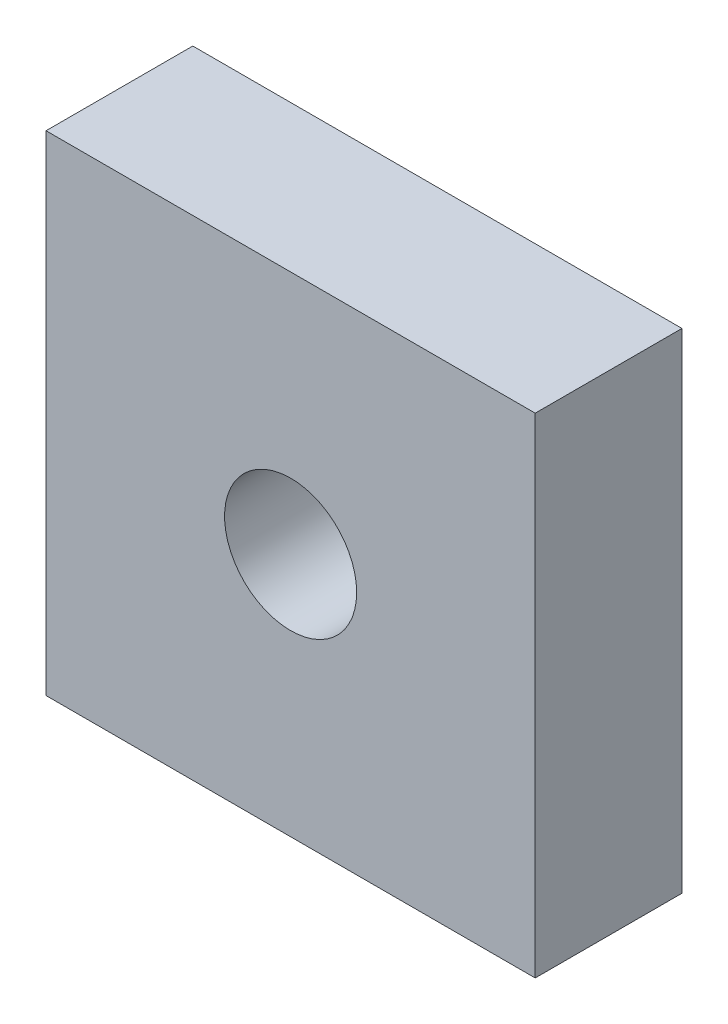
ISO-10303-21;
HEADER;
FILE_DESCRIPTION(('STEP AP214'),'2;1');
FILE_NAME('part.step','',(''),(''),'','','');
FILE_SCHEMA(('AUTOMOTIVE_DESIGN { 1 0 10303 214 1 1 1 1 }'));
ENDSEC;
DATA;
#1=APPLICATION_CONTEXT('core data for automotive mechanical design processes');
#2=APPLICATION_PROTOCOL_DEFINITION('international standard','automotive_design',2000,#1);
#3=PRODUCT_CONTEXT('',#1,'mechanical');
#4=PRODUCT('Part','Part','',(#3));
#5=PRODUCT_RELATED_PRODUCT_CATEGORY('part','',(#4));
#6=PRODUCT_DEFINITION_FORMATION('','',#4);
#7=PRODUCT_DEFINITION_CONTEXT('part definition',#1,'design');
#8=PRODUCT_DEFINITION('design','',#6,#7);
#9=PRODUCT_DEFINITION_SHAPE('','',#8);
#10=(LENGTH_UNIT() NAMED_UNIT(*) SI_UNIT(.MILLI.,.METRE.));
#11=(NAMED_UNIT(*) PLANE_ANGLE_UNIT() SI_UNIT($,.RADIAN.));
#12=(NAMED_UNIT(*) SI_UNIT($,.STERADIAN.) SOLID_ANGLE_UNIT());
#13=UNCERTAINTY_MEASURE_WITH_UNIT(LENGTH_MEASURE(1.E-05),#10,'distance_accuracy_value','');
#14=(GEOMETRIC_REPRESENTATION_CONTEXT(3) GLOBAL_UNCERTAINTY_ASSIGNED_CONTEXT((#13)) GLOBAL_UNIT_ASSIGNED_CONTEXT((#10,
#11,#12)) REPRESENTATION_CONTEXT('',''));
#15=CARTESIAN_POINT('',(0.,0.,0.));
#16=DIRECTION('',(0.,0.,1.));
#17=DIRECTION('',(1.,0.,0.));
#18=AXIS2_PLACEMENT_3D('',#15,#16,#17);
#19=CARTESIAN_POINT('',(0.,0.,6.));
#20=DIRECTION('',(0.,0.,1.));
#21=DIRECTION('',(1.,0.,0.));
#22=AXIS2_PLACEMENT_3D('',#19,#20,#21);
#23=PLANE('',#22);
#24=DIRECTION('',(0.,1.,0.));
#25=VECTOR('',#24,1.);
#26=CARTESIAN_POINT('',(10.,10.,6.));
#27=LINE('',#26,#25);
#28=CARTESIAN_POINT('',(10.,-10.,6.));
#29=VERTEX_POINT('',#28);
#30=CARTESIAN_POINT('',(10.,10.,6.));
#31=VERTEX_POINT('',#30);
#32=EDGE_CURVE('E88',#29,#31,#27,.T.);
#33=ORIENTED_EDGE('',*,*,#32,.T.);
#34=DIRECTION('',(-1.,0.,0.));
#35=VECTOR('',#34,1.);
#36=CARTESIAN_POINT('',(-10.,10.,6.));
#37=LINE('',#36,#35);
#38=CARTESIAN_POINT('',(-10.,10.,6.));
#39=VERTEX_POINT('',#38);
#40=EDGE_CURVE('E83',#31,#39,#37,.T.);
#41=ORIENTED_EDGE('',*,*,#40,.T.);
#42=DIRECTION('',(0.,-1.,0.));
#43=VECTOR('',#42,1.);
#44=CARTESIAN_POINT('',(-10.,10.,6.));
#45=LINE('',#44,#43);
#46=CARTESIAN_POINT('',(-10.,-10.,6.));
#47=VERTEX_POINT('',#46);
#48=EDGE_CURVE('E86',#39,#47,#45,.T.);
#49=ORIENTED_EDGE('',*,*,#48,.T.);
#50=DIRECTION('',(1.,0.,0.));
#51=VECTOR('',#50,1.);
#52=CARTESIAN_POINT('',(-10.,-10.,6.));
#53=LINE('',#52,#51);
#54=EDGE_CURVE('E53',#47,#29,#53,.T.);
#55=ORIENTED_EDGE('',*,*,#54,.T.);
#56=EDGE_LOOP('',(#33,#41,#49,#55));
#57=FACE_BOUND('',#56,.T.);
#58=CARTESIAN_POINT('',(0.,0.,6.));
#59=DIRECTION('',(0.,0.,1.));
#60=DIRECTION('',(1.,0.,0.));
#61=AXIS2_PLACEMENT_3D('',#58,#59,#60);
#62=CIRCLE('',#61,2.7);
#63=CARTESIAN_POINT('',(2.7,0.,6.));
#64=VERTEX_POINT('',#63);
#65=EDGE_CURVE('E103',#64,#64,#62,.T.);
#66=ORIENTED_EDGE('',*,*,#65,.F.);
#67=EDGE_LOOP('',(#66));
#68=FACE_BOUND('',#67,.T.);
#69=ADVANCED_FACE('F36',(#57,#68),#23,.T.);
#70=CARTESIAN_POINT('',(0.,0.,0.));
#71=DIRECTION('',(0.,0.,1.));
#72=DIRECTION('',(1.,0.,0.));
#73=AXIS2_PLACEMENT_3D('',#70,#71,#72);
#74=PLANE('',#73);
#75=DIRECTION('',(0.,1.,0.));
#76=VECTOR('',#75,1.);
#77=CARTESIAN_POINT('',(10.,10.,0.));
#78=LINE('',#77,#76);
#79=CARTESIAN_POINT('',(10.,-10.,0.));
#80=VERTEX_POINT('',#79);
#81=CARTESIAN_POINT('',(10.,10.,0.));
#82=VERTEX_POINT('',#81);
#83=EDGE_CURVE('E100',#80,#82,#78,.T.);
#84=ORIENTED_EDGE('',*,*,#83,.F.);
#85=DIRECTION('',(1.,0.,0.));
#86=VECTOR('',#85,1.);
#87=CARTESIAN_POINT('',(-10.,-10.,0.));
#88=LINE('',#87,#86);
#89=CARTESIAN_POINT('',(-10.,-10.,0.));
#90=VERTEX_POINT('',#89);
#91=EDGE_CURVE('E76',#90,#80,#88,.T.);
#92=ORIENTED_EDGE('',*,*,#91,.F.);
#93=DIRECTION('',(0.,-1.,0.));
#94=VECTOR('',#93,1.);
#95=CARTESIAN_POINT('',(-10.,10.,0.));
#96=LINE('',#95,#94);
#97=CARTESIAN_POINT('',(-10.,10.,0.));
#98=VERTEX_POINT('',#97);
#99=EDGE_CURVE('E70',#98,#90,#96,.T.);
#100=ORIENTED_EDGE('',*,*,#99,.F.);
#101=DIRECTION('',(-1.,0.,0.));
#102=VECTOR('',#101,1.);
#103=CARTESIAN_POINT('',(-10.,10.,0.));
#104=LINE('',#103,#102);
#105=EDGE_CURVE('E92',#82,#98,#104,.T.);
#106=ORIENTED_EDGE('',*,*,#105,.F.);
#107=EDGE_LOOP('',(#84,#92,#100,#106));
#108=FACE_BOUND('',#107,.T.);
#109=CARTESIAN_POINT('',(0.,0.,0.));
#110=DIRECTION('',(0.,0.,1.));
#111=DIRECTION('',(1.,0.,0.));
#112=AXIS2_PLACEMENT_3D('',#109,#110,#111);
#113=CIRCLE('',#112,2.7);
#114=CARTESIAN_POINT('',(2.7,0.,0.));
#115=VERTEX_POINT('',#114);
#116=EDGE_CURVE('E115',#115,#115,#113,.T.);
#117=ORIENTED_EDGE('',*,*,#116,.T.);
#118=EDGE_LOOP('',(#117));
#119=FACE_BOUND('',#118,.T.);
#120=ADVANCED_FACE('F111',(#108,#119),#74,.F.);
#121=CARTESIAN_POINT('',(10.,10.,6.));
#122=DIRECTION('',(-1.,0.,0.));
#123=DIRECTION('',(0.,0.,1.));
#124=AXIS2_PLACEMENT_3D('',#121,#122,#123);
#125=PLANE('',#124);
#126=ORIENTED_EDGE('',*,*,#83,.T.);
#127=DIRECTION('',(0.,0.,-1.));
#128=VECTOR('',#127,1.);
#129=CARTESIAN_POINT('',(10.,10.,6.));
#130=LINE('',#129,#128);
#131=EDGE_CURVE('E11',#31,#82,#130,.T.);
#132=ORIENTED_EDGE('',*,*,#131,.F.);
#133=ORIENTED_EDGE('',*,*,#32,.F.);
#134=DIRECTION('',(0.,0.,-1.));
#135=VECTOR('',#134,1.);
#136=CARTESIAN_POINT('',(10.,-10.,6.));
#137=LINE('',#136,#135);
#138=EDGE_CURVE('E96',#29,#80,#137,.T.);
#139=ORIENTED_EDGE('',*,*,#138,.T.);
#140=EDGE_LOOP('',(#126,#132,#133,#139));
#141=FACE_BOUND('',#140,.T.);
#142=ADVANCED_FACE('F38',(#141),#125,.F.);
#143=CARTESIAN_POINT('',(-10.,10.,6.));
#144=DIRECTION('',(0.,-1.,0.));
#145=DIRECTION('',(0.,0.,-1.));
#146=AXIS2_PLACEMENT_3D('',#143,#144,#145);
#147=PLANE('',#146);
#148=ORIENTED_EDGE('',*,*,#105,.T.);
#149=DIRECTION('',(0.,0.,-1.));
#150=VECTOR('',#149,1.);
#151=CARTESIAN_POINT('',(-10.,10.,6.));
#152=LINE('',#151,#150);
#153=EDGE_CURVE('E45',#39,#98,#152,.T.);
#154=ORIENTED_EDGE('',*,*,#153,.F.);
#155=ORIENTED_EDGE('',*,*,#40,.F.);
#156=ORIENTED_EDGE('',*,*,#131,.T.);
#157=EDGE_LOOP('',(#148,#154,#155,#156));
#158=FACE_BOUND('',#157,.T.);
#159=ADVANCED_FACE('F91',(#158),#147,.F.);
#160=CARTESIAN_POINT('',(-10.,10.,6.));
#161=DIRECTION('',(1.,0.,0.));
#162=DIRECTION('',(0.,1.,0.));
#163=AXIS2_PLACEMENT_3D('',#160,#161,#162);
#164=PLANE('',#163);
#165=ORIENTED_EDGE('',*,*,#99,.T.);
#166=DIRECTION('',(0.,0.,-1.));
#167=VECTOR('',#166,1.);
#168=CARTESIAN_POINT('',(-10.,-10.,6.));
#169=LINE('',#168,#167);
#170=EDGE_CURVE('E93',#47,#90,#169,.T.);
#171=ORIENTED_EDGE('',*,*,#170,.F.);
#172=ORIENTED_EDGE('',*,*,#48,.F.);
#173=ORIENTED_EDGE('',*,*,#153,.T.);
#174=EDGE_LOOP('',(#165,#171,#172,#173));
#175=FACE_BOUND('',#174,.T.);
#176=ADVANCED_FACE('F94',(#175),#164,.F.);
#177=CARTESIAN_POINT('',(-10.,-10.,6.));
#178=DIRECTION('',(0.,1.,0.));
#179=DIRECTION('',(0.,0.,1.));
#180=AXIS2_PLACEMENT_3D('',#177,#178,#179);
#181=PLANE('',#180);
#182=ORIENTED_EDGE('',*,*,#91,.T.);
#183=ORIENTED_EDGE('',*,*,#138,.F.);
#184=ORIENTED_EDGE('',*,*,#54,.F.);
#185=ORIENTED_EDGE('',*,*,#170,.T.);
#186=EDGE_LOOP('',(#182,#183,#184,#185));
#187=FACE_BOUND('',#186,.T.);
#188=ADVANCED_FACE('F108',(#187),#181,.F.);
#189=CARTESIAN_POINT('',(0.,0.,6.));
#190=DIRECTION('',(0.,0.,-1.));
#191=DIRECTION('',(-1.,0.,0.));
#192=AXIS2_PLACEMENT_3D('',#189,#190,#191);
#193=CYLINDRICAL_SURFACE('',#192,2.7);
#194=ORIENTED_EDGE('',*,*,#65,.T.);
#195=EDGE_LOOP('',(#194));
#196=FACE_BOUND('',#195,.T.);
#197=ORIENTED_EDGE('',*,*,#116,.F.);
#198=EDGE_LOOP('',(#197));
#199=FACE_BOUND('',#198,.T.);
#200=ADVANCED_FACE('F121',(#196,#199),#193,.F.);
#201=CLOSED_SHELL('',(#69,#120,#142,#159,#176,#188,#200));
#202=MANIFOLD_SOLID_BREP('B2',#201);
#203=ADVANCED_BREP_SHAPE_REPRESENTATION('',(#18,#202),#14);
#204=SHAPE_DEFINITION_REPRESENTATION(#9,#203);
ENDSEC;
END-ISO-10303-21;
